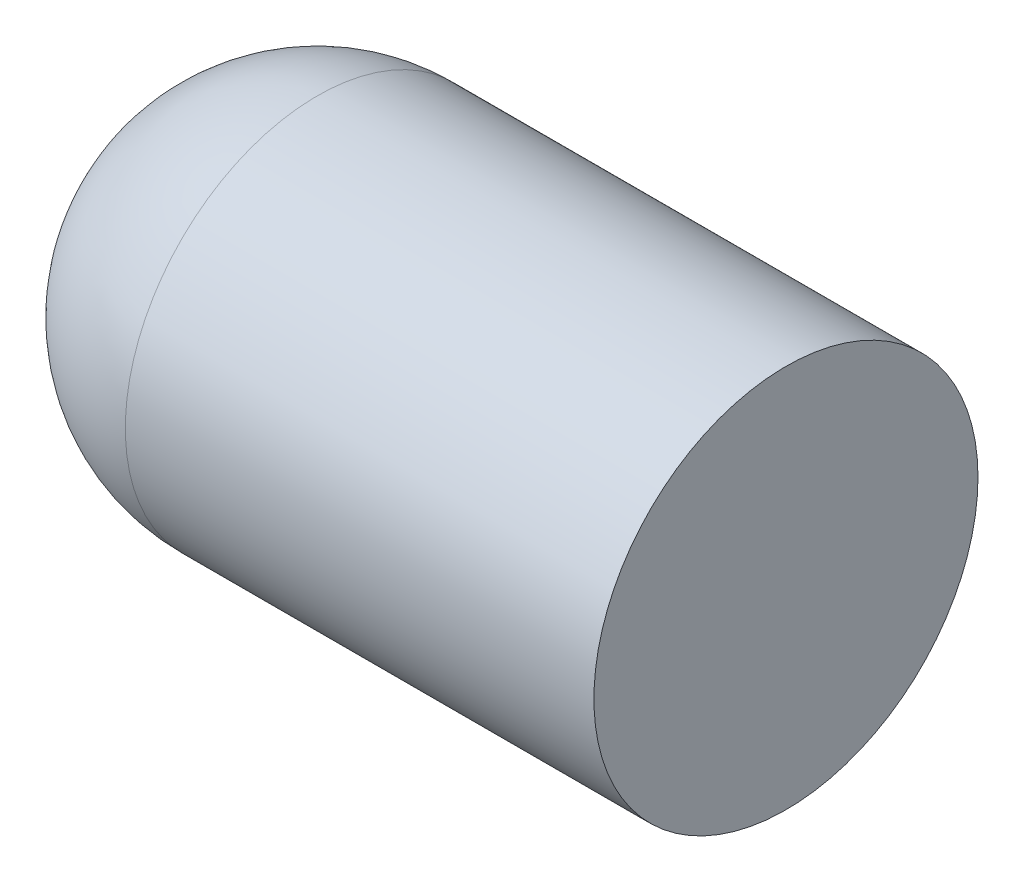
ISO-10303-21;
HEADER;
FILE_DESCRIPTION(('STEP AP214'),'2;1');
FILE_NAME('part.step','',(''),(''),'','','');
FILE_SCHEMA(('AUTOMOTIVE_DESIGN { 1 0 10303 214 1 1 1 1 }'));
ENDSEC;
DATA;
#1=APPLICATION_CONTEXT('core data for automotive mechanical design processes');
#2=APPLICATION_PROTOCOL_DEFINITION('international standard','automotive_design',2000,#1);
#3=PRODUCT_CONTEXT('',#1,'mechanical');
#4=PRODUCT('Part','Part','',(#3));
#5=PRODUCT_RELATED_PRODUCT_CATEGORY('part','',(#4));
#6=PRODUCT_DEFINITION_FORMATION('','',#4);
#7=PRODUCT_DEFINITION_CONTEXT('part definition',#1,'design');
#8=PRODUCT_DEFINITION('design','',#6,#7);
#9=PRODUCT_DEFINITION_SHAPE('','',#8);
#10=(LENGTH_UNIT() NAMED_UNIT(*) SI_UNIT(.MILLI.,.METRE.));
#11=(NAMED_UNIT(*) PLANE_ANGLE_UNIT() SI_UNIT($,.RADIAN.));
#12=(NAMED_UNIT(*) SI_UNIT($,.STERADIAN.) SOLID_ANGLE_UNIT());
#13=UNCERTAINTY_MEASURE_WITH_UNIT(LENGTH_MEASURE(1.E-05),#10,'distance_accuracy_value','');
#14=(GEOMETRIC_REPRESENTATION_CONTEXT(3) GLOBAL_UNCERTAINTY_ASSIGNED_CONTEXT((#13)) GLOBAL_UNIT_ASSIGNED_CONTEXT((#10,
#11,#12)) REPRESENTATION_CONTEXT('',''));
#15=CARTESIAN_POINT('',(0.,0.,0.));
#16=DIRECTION('',(0.,0.,1.));
#17=DIRECTION('',(1.,0.,0.));
#18=AXIS2_PLACEMENT_3D('',#15,#16,#17);
#19=CARTESIAN_POINT('',(6.1,0.,0.));
#20=DIRECTION('',(-1.,0.,0.));
#21=DIRECTION('',(0.,0.,1.));
#22=AXIS2_PLACEMENT_3D('',#19,#20,#21);
#23=CYLINDRICAL_SURFACE('',#22,2.5);
#24=CARTESIAN_POINT('',(6.1,0.,0.));
#25=DIRECTION('',(1.,0.,0.));
#26=DIRECTION('',(0.,0.,-1.));
#27=AXIS2_PLACEMENT_3D('',#24,#25,#26);
#28=CIRCLE('',#27,2.5);
#29=CARTESIAN_POINT('',(6.1,0.,-2.5));
#30=VERTEX_POINT('',#29);
#31=EDGE_CURVE('E10',#30,#30,#28,.T.);
#32=ORIENTED_EDGE('',*,*,#31,.F.);
#33=EDGE_LOOP('',(#32));
#34=FACE_BOUND('',#33,.T.);
#35=CARTESIAN_POINT('',(0.,0.,0.));
#36=DIRECTION('',(1.,0.,0.));
#37=DIRECTION('',(0.,0.,-1.));
#38=AXIS2_PLACEMENT_3D('',#35,#36,#37);
#39=CIRCLE('',#38,2.5);
#40=CARTESIAN_POINT('',(0.,0.,-2.5));
#41=VERTEX_POINT('',#40);
#42=EDGE_CURVE('E40',#41,#41,#39,.T.);
#43=ORIENTED_EDGE('',*,*,#42,.T.);
#44=EDGE_LOOP('',(#43));
#45=FACE_BOUND('',#44,.T.);
#46=ADVANCED_FACE('F36',(#34,#45),#23,.T.);
#47=CARTESIAN_POINT('',(6.1,0.,0.));
#48=DIRECTION('',(1.,0.,0.));
#49=DIRECTION('',(0.,0.,-1.));
#50=AXIS2_PLACEMENT_3D('',#47,#48,#49);
#51=PLANE('',#50);
#52=ORIENTED_EDGE('',*,*,#31,.T.);
#53=EDGE_LOOP('',(#52));
#54=FACE_BOUND('',#53,.T.);
#55=ADVANCED_FACE('F53',(#54),#51,.T.);
#56=CARTESIAN_POINT('',(0.,0.,0.));
#57=DIRECTION('',(0.,-1.,0.));
#58=DIRECTION('',(0.,0.,-1.));
#59=AXIS2_PLACEMENT_3D('',#56,#57,#58);
#60=SPHERICAL_SURFACE('',#59,2.5);
#61=CARTESIAN_POINT('',(0.,0.,0.));
#62=DIRECTION('',(1.,0.,0.));
#63=DIRECTION('',(0.,0.,-1.));
#64=AXIS2_PLACEMENT_3D('',#61,#62,#63);
#65=SPHERICAL_SURFACE('',#64,2.5);
#66=ORIENTED_EDGE('',*,*,#42,.F.);
#67=EDGE_LOOP('',(#66));
#68=FACE_BOUND('',#67,.T.);
#69=ADVANCED_FACE('F38',(#68),#65,.T.);
#70=CLOSED_SHELL('',(#46,#55,#69));
#71=MANIFOLD_SOLID_BREP('B2',#70);
#72=ADVANCED_BREP_SHAPE_REPRESENTATION('',(#18,#71),#14);
#73=SHAPE_DEFINITION_REPRESENTATION(#9,#72);
ENDSEC;
END-ISO-10303-21;
